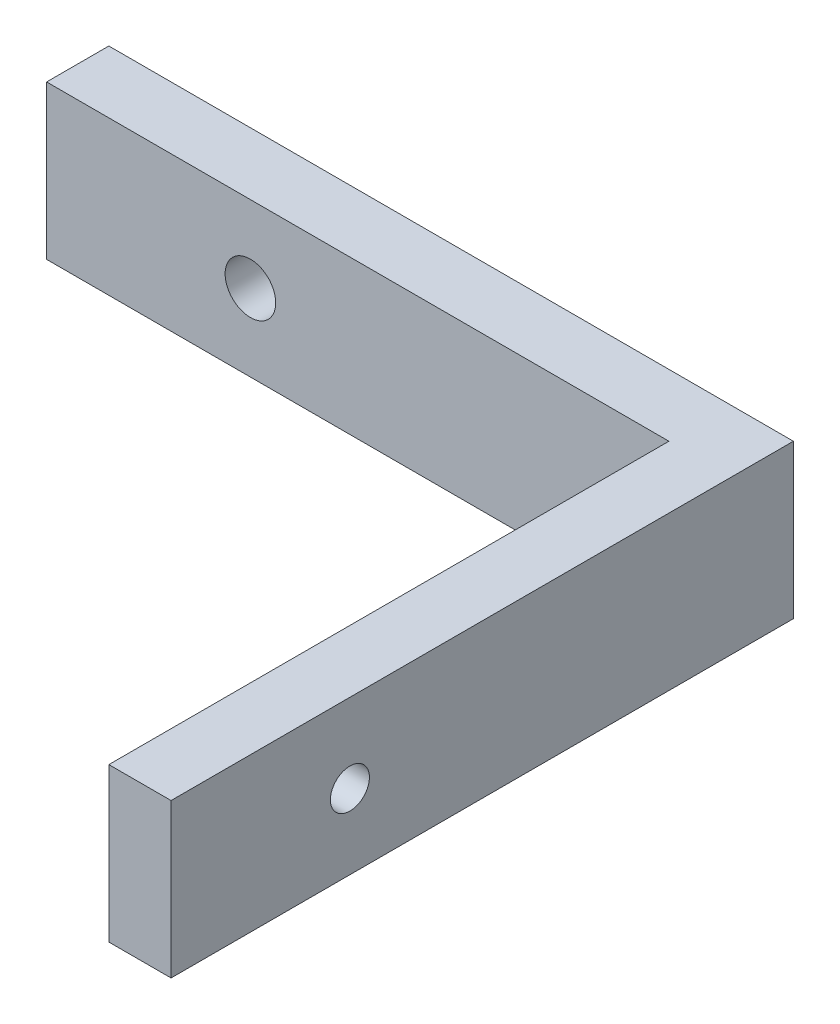
ISO-10303-21;
HEADER;
FILE_DESCRIPTION(('STEP AP214'),'2;1');
FILE_NAME('part.step','',(''),(''),'','','');
FILE_SCHEMA(('AUTOMOTIVE_DESIGN { 1 0 10303 214 1 1 1 1 }'));
ENDSEC;
DATA;
#1=APPLICATION_CONTEXT('core data for automotive mechanical design processes');
#2=APPLICATION_PROTOCOL_DEFINITION('international standard','automotive_design',2000,#1);
#3=PRODUCT_CONTEXT('',#1,'mechanical');
#4=PRODUCT('Part','Part','',(#3));
#5=PRODUCT_RELATED_PRODUCT_CATEGORY('part','',(#4));
#6=PRODUCT_DEFINITION_FORMATION('','',#4);
#7=PRODUCT_DEFINITION_CONTEXT('part definition',#1,'design');
#8=PRODUCT_DEFINITION('design','',#6,#7);
#9=PRODUCT_DEFINITION_SHAPE('','',#8);
#10=(LENGTH_UNIT() NAMED_UNIT(*) SI_UNIT(.MILLI.,.METRE.));
#11=(NAMED_UNIT(*) PLANE_ANGLE_UNIT() SI_UNIT($,.RADIAN.));
#12=(NAMED_UNIT(*) SI_UNIT($,.STERADIAN.) SOLID_ANGLE_UNIT());
#13=UNCERTAINTY_MEASURE_WITH_UNIT(LENGTH_MEASURE(1.E-05),#10,'distance_accuracy_value','');
#14=(GEOMETRIC_REPRESENTATION_CONTEXT(3) GLOBAL_UNCERTAINTY_ASSIGNED_CONTEXT((#13)) GLOBAL_UNIT_ASSIGNED_CONTEXT((#10,
#11,#12)) REPRESENTATION_CONTEXT('',''));
#15=CARTESIAN_POINT('',(0.,0.,0.));
#16=DIRECTION('',(0.,0.,1.));
#17=DIRECTION('',(1.,0.,0.));
#18=AXIS2_PLACEMENT_3D('',#15,#16,#17);
#19=CARTESIAN_POINT('',(7.14154464909152,0.,-10.));
#20=DIRECTION('',(-1.,0.,0.));
#21=DIRECTION('',(0.,0.,1.));
#22=AXIS2_PLACEMENT_3D('',#19,#20,#21);
#23=PLANE('',#22);
#24=DIRECTION('',(0.,-1.,0.));
#25=VECTOR('',#24,1.);
#26=CARTESIAN_POINT('',(7.14154464909152,0.,0.));
#27=LINE('',#26,#25);
#28=CARTESIAN_POINT('',(7.14154464909152,63.0877926656982,0.));
#29=VERTEX_POINT('',#28);
#30=CARTESIAN_POINT('',(7.14154464909152,38.389417028602,0.));
#31=VERTEX_POINT('',#30);
#32=EDGE_CURVE('E150',#29,#31,#27,.T.);
#33=ORIENTED_EDGE('',*,*,#32,.F.);
#34=DIRECTION('',(0.,0.,1.));
#35=VECTOR('',#34,1.);
#36=CARTESIAN_POINT('',(7.14154464909152,63.0877926656982,-10.));
#37=LINE('',#36,#35);
#38=CARTESIAN_POINT('',(7.14154464909152,63.0877926656982,-10.));
#39=VERTEX_POINT('',#38);
#40=EDGE_CURVE('E13',#39,#29,#37,.T.);
#41=ORIENTED_EDGE('',*,*,#40,.F.);
#42=DIRECTION('',(0.,-1.,0.));
#43=VECTOR('',#42,1.);
#44=CARTESIAN_POINT('',(7.14154464909152,0.,-10.));
#45=LINE('',#44,#43);
#46=CARTESIAN_POINT('',(7.14154464909152,38.389417028602,-10.));
#47=VERTEX_POINT('',#46);
#48=EDGE_CURVE('E110',#39,#47,#45,.T.);
#49=ORIENTED_EDGE('',*,*,#48,.T.);
#50=DIRECTION('',(0.,0.,1.));
#51=VECTOR('',#50,1.);
#52=CARTESIAN_POINT('',(7.14154464909152,38.389417028602,-10.));
#53=LINE('',#52,#51);
#54=EDGE_CURVE('E54',#47,#31,#53,.T.);
#55=ORIENTED_EDGE('',*,*,#54,.T.);
#56=EDGE_LOOP('',(#33,#41,#49,#55));
#57=FACE_BOUND('',#56,.T.);
#58=ADVANCED_FACE('F51',(#57),#23,.T.);
#59=CARTESIAN_POINT('',(0.,63.0877926656982,-10.));
#60=DIRECTION('',(0.,-1.,0.));
#61=DIRECTION('',(0.,0.,-1.));
#62=AXIS2_PLACEMENT_3D('',#59,#60,#61);
#63=PLANE('',#62);
#64=DIRECTION('',(1.,0.,0.));
#65=VECTOR('',#64,1.);
#66=CARTESIAN_POINT('',(0.,63.0877926656982,0.));
#67=LINE('',#66,#65);
#68=CARTESIAN_POINT('',(107.141544649092,63.0877926656982,0.));
#69=VERTEX_POINT('',#68);
#70=EDGE_CURVE('E79',#29,#69,#67,.T.);
#71=ORIENTED_EDGE('',*,*,#70,.T.);
#72=DIRECTION('',(0.,0.,1.));
#73=VECTOR('',#72,1.);
#74=CARTESIAN_POINT('',(107.141544649092,63.0877926656982,-10.));
#75=LINE('',#74,#73);
#76=CARTESIAN_POINT('',(107.141544649092,63.0877926656982,90.));
#77=VERTEX_POINT('',#76);
#78=EDGE_CURVE('E140',#69,#77,#75,.T.);
#79=ORIENTED_EDGE('',*,*,#78,.T.);
#80=DIRECTION('',(-1.,0.,0.));
#81=VECTOR('',#80,1.);
#82=CARTESIAN_POINT('',(117.141544649092,63.0877926656982,90.));
#83=LINE('',#82,#81);
#84=CARTESIAN_POINT('',(117.141544649092,63.0877926656982,90.));
#85=VERTEX_POINT('',#84);
#86=EDGE_CURVE('E118',#85,#77,#83,.T.);
#87=ORIENTED_EDGE('',*,*,#86,.F.);
#88=DIRECTION('',(0.,0.,1.));
#89=VECTOR('',#88,1.);
#90=CARTESIAN_POINT('',(117.141544649092,63.0877926656982,-10.));
#91=LINE('',#90,#89);
#92=CARTESIAN_POINT('',(117.141544649092,63.0877926656982,-10.));
#93=VERTEX_POINT('',#92);
#94=EDGE_CURVE('E115',#93,#85,#91,.T.);
#95=ORIENTED_EDGE('',*,*,#94,.F.);
#96=DIRECTION('',(1.,0.,0.));
#97=VECTOR('',#96,1.);
#98=CARTESIAN_POINT('',(0.,63.0877926656982,-10.));
#99=LINE('',#98,#97);
#100=EDGE_CURVE('E103',#39,#93,#99,.T.);
#101=ORIENTED_EDGE('',*,*,#100,.F.);
#102=ORIENTED_EDGE('',*,*,#40,.T.);
#103=EDGE_LOOP('',(#71,#79,#87,#95,#101,#102));
#104=FACE_BOUND('',#103,.T.);
#105=ADVANCED_FACE('F116',(#104),#63,.F.);
#106=CARTESIAN_POINT('',(0.,38.389417028602,-10.));
#107=DIRECTION('',(0.,-1.,0.));
#108=DIRECTION('',(0.,0.,-1.));
#109=AXIS2_PLACEMENT_3D('',#106,#107,#108);
#110=PLANE('',#109);
#111=DIRECTION('',(1.,0.,0.));
#112=VECTOR('',#111,1.);
#113=CARTESIAN_POINT('',(0.,38.389417028602,0.));
#114=LINE('',#113,#112);
#115=CARTESIAN_POINT('',(107.141544649092,38.389417028602,0.));
#116=VERTEX_POINT('',#115);
#117=EDGE_CURVE('E158',#31,#116,#114,.T.);
#118=ORIENTED_EDGE('',*,*,#117,.F.);
#119=ORIENTED_EDGE('',*,*,#54,.F.);
#120=DIRECTION('',(1.,0.,0.));
#121=VECTOR('',#120,1.);
#122=CARTESIAN_POINT('',(0.,38.389417028602,-10.));
#123=LINE('',#122,#121);
#124=CARTESIAN_POINT('',(117.141544649092,38.389417028602,-10.));
#125=VERTEX_POINT('',#124);
#126=EDGE_CURVE('E112',#47,#125,#123,.T.);
#127=ORIENTED_EDGE('',*,*,#126,.T.);
#128=DIRECTION('',(0.,0.,-1.));
#129=VECTOR('',#128,1.);
#130=CARTESIAN_POINT('',(117.141544649092,38.389417028602,-10.));
#131=LINE('',#130,#129);
#132=CARTESIAN_POINT('',(117.141544649092,38.389417028602,90.));
#133=VERTEX_POINT('',#132);
#134=EDGE_CURVE('E127',#133,#125,#131,.T.);
#135=ORIENTED_EDGE('',*,*,#134,.F.);
#136=DIRECTION('',(-1.,0.,0.));
#137=VECTOR('',#136,1.);
#138=CARTESIAN_POINT('',(117.141544649092,38.389417028602,90.));
#139=LINE('',#138,#137);
#140=CARTESIAN_POINT('',(107.141544649092,38.389417028602,90.));
#141=VERTEX_POINT('',#140);
#142=EDGE_CURVE('E139',#133,#141,#139,.T.);
#143=ORIENTED_EDGE('',*,*,#142,.T.);
#144=DIRECTION('',(0.,0.,-1.));
#145=VECTOR('',#144,1.);
#146=CARTESIAN_POINT('',(107.141544649092,38.389417028602,-10.));
#147=LINE('',#146,#145);
#148=EDGE_CURVE('E128',#141,#116,#147,.T.);
#149=ORIENTED_EDGE('',*,*,#148,.T.);
#150=EDGE_LOOP('',(#118,#119,#127,#135,#143,#149));
#151=FACE_BOUND('',#150,.T.);
#152=ADVANCED_FACE('F182',(#151),#110,.T.);
#153=CARTESIAN_POINT('',(39.890553187095,50.7386048471501,-10.));
#154=DIRECTION('',(0.,0.,1.));
#155=DIRECTION('',(1.,0.,0.));
#156=AXIS2_PLACEMENT_3D('',#153,#154,#155);
#157=CYLINDRICAL_SURFACE('',#156,4.06538173152767);
#158=CARTESIAN_POINT('',(39.890553187095,50.7386048471501,-10.));
#159=DIRECTION('',(0.,0.,1.));
#160=DIRECTION('',(1.,0.,0.));
#161=AXIS2_PLACEMENT_3D('',#158,#159,#160);
#162=CIRCLE('',#161,4.06538173152767);
#163=CARTESIAN_POINT('',(43.9559349186227,50.7386048471501,-10.));
#164=VERTEX_POINT('',#163);
#165=EDGE_CURVE('E111',#164,#164,#162,.T.);
#166=ORIENTED_EDGE('',*,*,#165,.F.);
#167=EDGE_LOOP('',(#166));
#168=FACE_BOUND('',#167,.T.);
#169=CARTESIAN_POINT('',(39.890553187095,50.7386048471501,0.));
#170=DIRECTION('',(0.,0.,1.));
#171=DIRECTION('',(1.,0.,0.));
#172=AXIS2_PLACEMENT_3D('',#169,#170,#171);
#173=CIRCLE('',#172,4.06538173152767);
#174=CARTESIAN_POINT('',(43.9559349186227,50.7386048471501,0.));
#175=VERTEX_POINT('',#174);
#176=EDGE_CURVE('E152',#175,#175,#173,.T.);
#177=ORIENTED_EDGE('',*,*,#176,.T.);
#178=EDGE_LOOP('',(#177));
#179=FACE_BOUND('',#178,.T.);
#180=ADVANCED_FACE('F164',(#168,#179),#157,.F.);
#181=CARTESIAN_POINT('',(0.,0.,-10.));
#182=DIRECTION('',(0.,0.,1.));
#183=DIRECTION('',(1.,0.,0.));
#184=AXIS2_PLACEMENT_3D('',#181,#182,#183);
#185=PLANE('',#184);
#186=ORIENTED_EDGE('',*,*,#48,.F.);
#187=ORIENTED_EDGE('',*,*,#100,.T.);
#188=DIRECTION('',(0.,1.,0.));
#189=VECTOR('',#188,1.);
#190=CARTESIAN_POINT('',(117.141544649092,63.0877926656982,-10.));
#191=LINE('',#190,#189);
#192=EDGE_CURVE('E109',#125,#93,#191,.T.);
#193=ORIENTED_EDGE('',*,*,#192,.F.);
#194=ORIENTED_EDGE('',*,*,#126,.F.);
#195=EDGE_LOOP('',(#186,#187,#193,#194));
#196=FACE_BOUND('',#195,.T.);
#197=ORIENTED_EDGE('',*,*,#165,.T.);
#198=EDGE_LOOP('',(#197));
#199=FACE_BOUND('',#198,.T.);
#200=ADVANCED_FACE('F105',(#196,#199),#185,.F.);
#201=CARTESIAN_POINT('',(0.,0.,0.));
#202=DIRECTION('',(0.,0.,1.));
#203=DIRECTION('',(1.,0.,0.));
#204=AXIS2_PLACEMENT_3D('',#201,#202,#203);
#205=PLANE('',#204);
#206=ORIENTED_EDGE('',*,*,#32,.T.);
#207=ORIENTED_EDGE('',*,*,#117,.T.);
#208=DIRECTION('',(0.,-1.,0.));
#209=VECTOR('',#208,1.);
#210=CARTESIAN_POINT('',(107.141544649092,63.0877926656982,0.));
#211=LINE('',#210,#209);
#212=EDGE_CURVE('E147',#69,#116,#211,.T.);
#213=ORIENTED_EDGE('',*,*,#212,.F.);
#214=ORIENTED_EDGE('',*,*,#70,.F.);
#215=EDGE_LOOP('',(#206,#207,#213,#214));
#216=FACE_BOUND('',#215,.T.);
#217=ORIENTED_EDGE('',*,*,#176,.F.);
#218=EDGE_LOOP('',(#217));
#219=FACE_BOUND('',#218,.T.);
#220=ADVANCED_FACE('F166',(#216,#219),#205,.T.);
#221=CARTESIAN_POINT('',(117.141544649092,0.,0.));
#222=DIRECTION('',(-1.,0.,0.));
#223=DIRECTION('',(0.,0.,1.));
#224=AXIS2_PLACEMENT_3D('',#221,#222,#223);
#225=PLANE('',#224);
#226=ORIENTED_EDGE('',*,*,#192,.T.);
#227=ORIENTED_EDGE('',*,*,#94,.T.);
#228=DIRECTION('',(0.,-1.,0.));
#229=VECTOR('',#228,1.);
#230=CARTESIAN_POINT('',(117.141544649092,63.0877926656982,90.));
#231=LINE('',#230,#229);
#232=EDGE_CURVE('E121',#85,#133,#231,.T.);
#233=ORIENTED_EDGE('',*,*,#232,.T.);
#234=ORIENTED_EDGE('',*,*,#134,.T.);
#235=EDGE_LOOP('',(#226,#227,#233,#234));
#236=FACE_BOUND('',#235,.T.);
#237=CARTESIAN_POINT('',(117.141544649092,50.3871555031784,61.2640274636036));
#238=DIRECTION('',(1.,0.,0.));
#239=DIRECTION('',(0.,0.,-1.));
#240=AXIS2_PLACEMENT_3D('',#237,#238,#239);
#241=CIRCLE('',#240,3.13544056145611);
#242=CARTESIAN_POINT('',(117.141544649092,50.3871555031784,58.1285869021474));
#243=VERTEX_POINT('',#242);
#244=EDGE_CURVE('E142',#243,#243,#241,.T.);
#245=ORIENTED_EDGE('',*,*,#244,.F.);
#246=EDGE_LOOP('',(#245));
#247=FACE_BOUND('',#246,.T.);
#248=ADVANCED_FACE('F124',(#236,#247),#225,.F.);
#249=CARTESIAN_POINT('',(107.141544649092,0.,0.));
#250=DIRECTION('',(-1.,0.,0.));
#251=DIRECTION('',(0.,0.,1.));
#252=AXIS2_PLACEMENT_3D('',#249,#250,#251);
#253=PLANE('',#252);
#254=ORIENTED_EDGE('',*,*,#78,.F.);
#255=ORIENTED_EDGE('',*,*,#212,.T.);
#256=ORIENTED_EDGE('',*,*,#148,.F.);
#257=DIRECTION('',(0.,-1.,0.));
#258=VECTOR('',#257,1.);
#259=CARTESIAN_POINT('',(107.141544649092,63.0877926656982,90.));
#260=LINE('',#259,#258);
#261=EDGE_CURVE('E131',#77,#141,#260,.T.);
#262=ORIENTED_EDGE('',*,*,#261,.F.);
#263=EDGE_LOOP('',(#254,#255,#256,#262));
#264=FACE_BOUND('',#263,.T.);
#265=CARTESIAN_POINT('',(107.141544649092,50.3871555031784,61.2640274636036));
#266=DIRECTION('',(1.,0.,0.));
#267=DIRECTION('',(0.,0.,-1.));
#268=AXIS2_PLACEMENT_3D('',#265,#266,#267);
#269=CIRCLE('',#268,3.13544056145611);
#270=CARTESIAN_POINT('',(107.141544649092,50.3871555031784,58.1285869021474));
#271=VERTEX_POINT('',#270);
#272=EDGE_CURVE('E134',#271,#271,#269,.T.);
#273=ORIENTED_EDGE('',*,*,#272,.T.);
#274=EDGE_LOOP('',(#273));
#275=FACE_BOUND('',#274,.T.);
#276=ADVANCED_FACE('F174',(#264,#275),#253,.T.);
#277=CARTESIAN_POINT('',(117.141544649092,63.0877926656982,90.));
#278=DIRECTION('',(0.,0.,-1.));
#279=DIRECTION('',(-1.,0.,0.));
#280=AXIS2_PLACEMENT_3D('',#277,#278,#279);
#281=PLANE('',#280);
#282=ORIENTED_EDGE('',*,*,#261,.T.);
#283=ORIENTED_EDGE('',*,*,#142,.F.);
#284=ORIENTED_EDGE('',*,*,#232,.F.);
#285=ORIENTED_EDGE('',*,*,#86,.T.);
#286=EDGE_LOOP('',(#282,#283,#284,#285));
#287=FACE_BOUND('',#286,.T.);
#288=ADVANCED_FACE('F190',(#287),#281,.F.);
#289=CARTESIAN_POINT('',(117.141544649092,50.3871555031784,61.2640274636036));
#290=DIRECTION('',(-1.,0.,0.));
#291=DIRECTION('',(0.,0.,1.));
#292=AXIS2_PLACEMENT_3D('',#289,#290,#291);
#293=CYLINDRICAL_SURFACE('',#292,3.13544056145611);
#294=ORIENTED_EDGE('',*,*,#244,.T.);
#295=EDGE_LOOP('',(#294));
#296=FACE_BOUND('',#295,.T.);
#297=ORIENTED_EDGE('',*,*,#272,.F.);
#298=EDGE_LOOP('',(#297));
#299=FACE_BOUND('',#298,.T.);
#300=ADVANCED_FACE('F238',(#296,#299),#293,.F.);
#301=CLOSED_SHELL('',(#58,#105,#152,#180,#200,#220,#248,#276,#288,#300));
#302=MANIFOLD_SOLID_BREP('B2',#301);
#303=ADVANCED_BREP_SHAPE_REPRESENTATION('',(#18,#302),#14);
#304=SHAPE_DEFINITION_REPRESENTATION(#9,#303);
ENDSEC;
END-ISO-10303-21;
